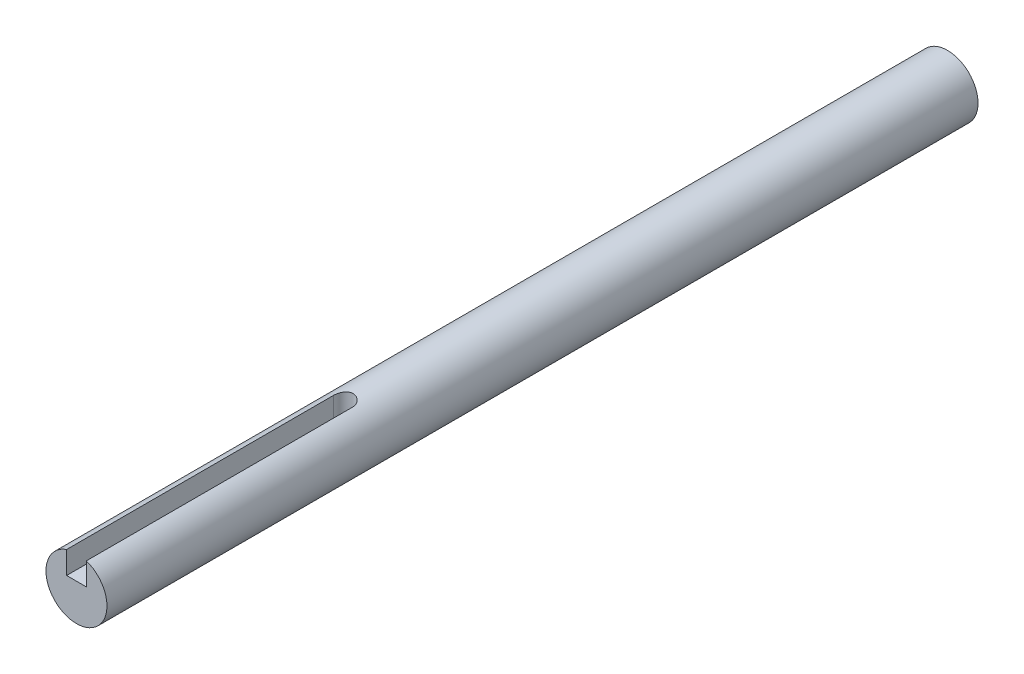
ISO-10303-21;
HEADER;
FILE_DESCRIPTION(('STEP AP214'),'2;1');
FILE_NAME('part.step','',(''),(''),'','','');
FILE_SCHEMA(('AUTOMOTIVE_DESIGN { 1 0 10303 214 1 1 1 1 }'));
ENDSEC;
DATA;
#1=APPLICATION_CONTEXT('core data for automotive mechanical design processes');
#2=APPLICATION_PROTOCOL_DEFINITION('international standard','automotive_design',2000,#1);
#3=PRODUCT_CONTEXT('',#1,'mechanical');
#4=PRODUCT('Part','Part','',(#3));
#5=PRODUCT_RELATED_PRODUCT_CATEGORY('part','',(#4));
#6=PRODUCT_DEFINITION_FORMATION('','',#4);
#7=PRODUCT_DEFINITION_CONTEXT('part definition',#1,'design');
#8=PRODUCT_DEFINITION('design','',#6,#7);
#9=PRODUCT_DEFINITION_SHAPE('','',#8);
#10=(LENGTH_UNIT() NAMED_UNIT(*) SI_UNIT(.MILLI.,.METRE.));
#11=(NAMED_UNIT(*) PLANE_ANGLE_UNIT() SI_UNIT($,.RADIAN.));
#12=(NAMED_UNIT(*) SI_UNIT($,.STERADIAN.) SOLID_ANGLE_UNIT());
#13=UNCERTAINTY_MEASURE_WITH_UNIT(LENGTH_MEASURE(1.E-05),#10,'distance_accuracy_value','');
#14=(GEOMETRIC_REPRESENTATION_CONTEXT(3) GLOBAL_UNCERTAINTY_ASSIGNED_CONTEXT((#13)) GLOBAL_UNIT_ASSIGNED_CONTEXT((#10,
#11,#12)) REPRESENTATION_CONTEXT('',''));
#15=CARTESIAN_POINT('',(0.,0.,0.));
#16=DIRECTION('',(0.,0.,1.));
#17=DIRECTION('',(1.,0.,0.));
#18=AXIS2_PLACEMENT_3D('',#15,#16,#17);
#19=CARTESIAN_POINT('',(0.,0.,114.3));
#20=DIRECTION('',(0.,0.,-1.));
#21=DIRECTION('',(-1.,0.,0.));
#22=AXIS2_PLACEMENT_3D('',#19,#20,#21);
#23=CYLINDRICAL_SURFACE('',#22,4.);
#24=DIRECTION('',(0.,0.,-1.));
#25=VECTOR('',#24,1.);
#26=CARTESIAN_POINT('',(-1.2954,3.78443375420948,114.3));
#27=LINE('',#26,#25);
#28=CARTESIAN_POINT('',(-1.2954,3.78443375420948,114.3));
#29=VERTEX_POINT('',#28);
#30=CARTESIAN_POINT('',(-1.2954,3.78443375420948,79.3));
#31=VERTEX_POINT('',#30);
#32=EDGE_CURVE('E129',#29,#31,#27,.T.);
#33=ORIENTED_EDGE('',*,*,#32,.T.);
#34=CARTESIAN_POINT('',(-1.2954,3.78443375420948,79.3));
#35=CARTESIAN_POINT('',(-1.29540089993855,3.78443038867243,79.2645856350982));
#36=CARTESIAN_POINT('',(-1.29394680043407,3.78493149033154,79.2291892763617));
#37=CARTESIAN_POINT('',(-1.28815329161314,3.78690838639297,79.158669840242));
#38=CARTESIAN_POINT('',(-1.28381462226707,3.78838393082366,79.1235466951093));
#39=CARTESIAN_POINT('',(-1.26655040295758,3.79420686955889,79.0191739781485));
#40=CARTESIAN_POINT('',(-1.2493762096202,3.79995107552805,78.9506553555383));
#41=CARTESIAN_POINT('',(-1.20430961583037,3.81447115326452,78.8176773421035));
#42=CARTESIAN_POINT('',(-1.17642248600198,3.82324553401152,78.7532159732852));
#43=CARTESIAN_POINT('',(-1.11077558649104,3.84283070963279,78.6298330755361));
#44=CARTESIAN_POINT('',(-1.07301018562487,3.85364266505619,78.5709147325813));
#45=CARTESIAN_POINT('',(-0.987200334978944,3.87652773393015,78.4581674830687));
#46=CARTESIAN_POINT('',(-0.938855564188154,3.88863084814642,78.4045732800058));
#47=CARTESIAN_POINT('',(-0.833898407008472,3.91248082642025,78.3060913876729));
#48=CARTESIAN_POINT('',(-0.777284575208968,3.92422762776082,78.261205223746));
#49=CARTESIAN_POINT('',(-0.655685042125725,3.94638861277619,78.1803588322411));
#50=CARTESIAN_POINT('',(-0.59052833686329,3.95676313868177,78.1446439859192));
#51=CARTESIAN_POINT('',(-0.454741556399191,3.97465608218752,78.0847747578372));
#52=CARTESIAN_POINT('',(-0.384113082914669,3.98217533182022,78.0606170077846));
#53=CARTESIAN_POINT('',(-0.241857410776138,3.99329749002933,78.0253401084411));
#54=CARTESIAN_POINT('',(-0.170339958465495,3.99702137324289,78.0138172479425));
#55=CARTESIAN_POINT('',(-0.0262948235930711,4.00056168444927,78.0028555556453));
#56=CARTESIAN_POINT('',(0.0462326292612889,4.00037898687836,78.003414019603));
#57=CARTESIAN_POINT('',(0.187386347106871,3.99620958823882,78.016339138081));
#58=CARTESIAN_POINT('',(0.256057590206129,3.99236408221408,78.0282675141455));
#59=CARTESIAN_POINT('',(0.390364246333562,3.98147682477638,78.0628714993921));
#60=CARTESIAN_POINT('',(0.455999492863256,3.97443489829551,78.0855476972354));
#61=CARTESIAN_POINT('',(0.583355124158089,3.95776169177717,78.1412714351817));
#62=CARTESIAN_POINT('',(0.64501488983981,3.94809852724524,78.1744475845163));
#63=CARTESIAN_POINT('',(0.762024302775174,3.92719452853168,78.2501247904345));
#64=CARTESIAN_POINT('',(0.8173723120433,3.91595328649872,78.292628259252));
#65=CARTESIAN_POINT('',(0.922793064036735,3.89249279693083,78.3879763579872));
#66=CARTESIAN_POINT('',(0.972521413439922,3.88025228871121,78.4411970284795));
#67=CARTESIAN_POINT('',(1.06246368094595,3.8565969197441,78.5553441146934));
#68=CARTESIAN_POINT('',(1.1026746285421,3.84518231754253,78.6162729271467));
#69=CARTESIAN_POINT('',(1.17288806365364,3.82435579093652,78.7451552946598));
#70=CARTESIAN_POINT('',(1.20274771286602,3.81497251163787,78.813191478514));
#71=CARTESIAN_POINT('',(1.25043886520411,3.79961057474187,78.9536696936676));
#72=CARTESIAN_POINT('',(1.26828915669409,3.79362660130247,79.0261046486862));
#73=CARTESIAN_POINT('',(1.28499130456776,3.78798385812158,79.1326989344663));
#74=CARTESIAN_POINT('',(1.28889332184615,3.78665607987967,79.1660476003343));
#75=CARTESIAN_POINT('',(1.29409576559409,3.78488057931157,79.2329249869199));
#76=CARTESIAN_POINT('',(1.29539970409083,3.78443166896493,79.2664534030565));
#77=CARTESIAN_POINT('',(1.2954,3.78443375420948,79.3));
#78=B_SPLINE_CURVE_WITH_KNOTS('',3,(#34,#35,#36,#37,#38,#39,#40,#41,#42,#43,#44,#45,#46,#47,#48,
#49,#50,#51,#52,#53,#54,#55,#56,#57,#58,#59,#60,#61,#62,#63,#64,#65,#66,#67,#68,#69,#70,#71,#72,
#73,#74,#75,#76,#77),.UNSPECIFIED.,.F.,.F.,(4,2,2,2,2,2,2,2,2,2,2,2,2,2,2,2,2,2,2,2,2,4),(0.,
0.106174536692487,0.212321847241342,0.423829768947444,0.635233764527355,0.846758536206068,
1.06532453166721,1.28392877772573,1.50788397197811,1.73177385511932,1.94828035723935,
2.16473839775983,2.37317633193305,2.58162568362652,2.79273406121236,3.00389710017801,
3.22445774440673,3.44508713801234,3.66864998053812,3.89186224571469,3.9925741935939,
4.09314990860757),.UNSPECIFIED.);
#79=CARTESIAN_POINT('',(1.2954,3.78443375420948,79.3));
#80=VERTEX_POINT('',#79);
#81=EDGE_CURVE('E80',#31,#80,#78,.T.);
#82=ORIENTED_EDGE('',*,*,#81,.T.);
#83=DIRECTION('',(0.,0.,-1.));
#84=VECTOR('',#83,1.);
#85=CARTESIAN_POINT('',(1.2954,3.78443375420948,114.3));
#86=LINE('',#85,#84);
#87=CARTESIAN_POINT('',(1.2954,3.78443375420948,114.3));
#88=VERTEX_POINT('',#87);
#89=EDGE_CURVE('E56',#80,#88,#86,.F.);
#90=ORIENTED_EDGE('',*,*,#89,.T.);
#91=CARTESIAN_POINT('',(0.,0.,114.3));
#92=DIRECTION('',(0.,0.,1.));
#93=DIRECTION('',(1.,0.,0.));
#94=AXIS2_PLACEMENT_3D('',#91,#92,#93);
#95=CIRCLE('',#94,4.);
#96=EDGE_CURVE('E11',#29,#88,#95,.T.);
#97=ORIENTED_EDGE('',*,*,#96,.F.);
#98=EDGE_LOOP('',(#33,#82,#90,#97));
#99=FACE_BOUND('',#98,.T.);
#100=CARTESIAN_POINT('',(0.,0.,0.));
#101=DIRECTION('',(0.,0.,1.));
#102=DIRECTION('',(1.,0.,0.));
#103=AXIS2_PLACEMENT_3D('',#100,#101,#102);
#104=CIRCLE('',#103,4.);
#105=CARTESIAN_POINT('',(4.,0.,0.));
#106=VERTEX_POINT('',#105);
#107=EDGE_CURVE('E37',#106,#106,#104,.T.);
#108=ORIENTED_EDGE('',*,*,#107,.T.);
#109=EDGE_LOOP('',(#108));
#110=FACE_BOUND('',#109,.T.);
#111=ADVANCED_FACE('F33',(#99,#110),#23,.T.);
#112=CARTESIAN_POINT('',(0.,0.,114.3));
#113=DIRECTION('',(0.,0.,1.));
#114=DIRECTION('',(1.,0.,0.));
#115=AXIS2_PLACEMENT_3D('',#112,#113,#114);
#116=PLANE('',#115);
#117=DIRECTION('',(0.,1.,0.));
#118=VECTOR('',#117,1.);
#119=CARTESIAN_POINT('',(1.2954,0.82500000951335,114.3));
#120=LINE('',#119,#118);
#121=CARTESIAN_POINT('',(1.2954,0.82500000951335,114.3));
#122=VERTEX_POINT('',#121);
#123=EDGE_CURVE('E99',#122,#88,#120,.T.);
#124=ORIENTED_EDGE('',*,*,#123,.F.);
#125=DIRECTION('',(1.,0.,0.));
#126=VECTOR('',#125,1.);
#127=CARTESIAN_POINT('',(-1.2954,0.82500000951335,114.3));
#128=LINE('',#127,#126);
#129=CARTESIAN_POINT('',(-1.2954,0.82500000951335,114.3));
#130=VERTEX_POINT('',#129);
#131=EDGE_CURVE('E89',#130,#122,#128,.T.);
#132=ORIENTED_EDGE('',*,*,#131,.F.);
#133=DIRECTION('',(0.,1.,0.));
#134=VECTOR('',#133,1.);
#135=CARTESIAN_POINT('',(-1.2954,0.82500000951335,114.3));
#136=LINE('',#135,#134);
#137=EDGE_CURVE('E83',#130,#29,#136,.T.);
#138=ORIENTED_EDGE('',*,*,#137,.T.);
#139=ORIENTED_EDGE('',*,*,#96,.T.);
#140=EDGE_LOOP('',(#124,#132,#138,#139));
#141=FACE_BOUND('',#140,.T.);
#142=ADVANCED_FACE('F115',(#141),#116,.T.);
#143=CARTESIAN_POINT('',(0.,0.,0.));
#144=DIRECTION('',(0.,0.,1.));
#145=DIRECTION('',(1.,0.,0.));
#146=AXIS2_PLACEMENT_3D('',#143,#144,#145);
#147=PLANE('',#146);
#148=ORIENTED_EDGE('',*,*,#107,.F.);
#149=EDGE_LOOP('',(#148));
#150=FACE_BOUND('',#149,.T.);
#151=ADVANCED_FACE('F113',(#150),#147,.F.);
#152=CARTESIAN_POINT('',(0.,0.82500000951335,79.3));
#153=DIRECTION('',(0.,1.,0.));
#154=DIRECTION('',(0.,0.,1.));
#155=AXIS2_PLACEMENT_3D('',#152,#153,#154);
#156=CYLINDRICAL_SURFACE('',#155,1.2954);
#157=DIRECTION('',(0.,1.,0.));
#158=VECTOR('',#157,1.);
#159=CARTESIAN_POINT('',(-1.2954,0.82500000951335,79.3));
#160=LINE('',#159,#158);
#161=CARTESIAN_POINT('',(-1.2954,0.82500000951335,79.3));
#162=VERTEX_POINT('',#161);
#163=EDGE_CURVE('E75',#162,#31,#160,.T.);
#164=ORIENTED_EDGE('',*,*,#163,.F.);
#165=CARTESIAN_POINT('',(0.,0.82500000951335,79.3));
#166=DIRECTION('',(0.,1.,0.));
#167=DIRECTION('',(0.,0.,-1.));
#168=AXIS2_PLACEMENT_3D('',#165,#166,#167);
#169=CIRCLE('',#168,1.2954);
#170=CARTESIAN_POINT('',(1.2954,0.82500000951335,79.3));
#171=VERTEX_POINT('',#170);
#172=EDGE_CURVE('E77',#171,#162,#169,.T.);
#173=ORIENTED_EDGE('',*,*,#172,.F.);
#174=DIRECTION('',(0.,1.,0.));
#175=VECTOR('',#174,1.);
#176=CARTESIAN_POINT('',(1.2954,0.82500000951335,79.3));
#177=LINE('',#176,#175);
#178=EDGE_CURVE('E97',#171,#80,#177,.T.);
#179=ORIENTED_EDGE('',*,*,#178,.T.);
#180=ORIENTED_EDGE('',*,*,#81,.F.);
#181=EDGE_LOOP('',(#164,#173,#179,#180));
#182=FACE_BOUND('',#181,.T.);
#183=ADVANCED_FACE('F76',(#182),#156,.F.);
#184=CARTESIAN_POINT('',(1.2954,0.82500000951335,79.3));
#185=DIRECTION('',(1.,0.,0.));
#186=DIRECTION('',(0.,0.,-1.));
#187=AXIS2_PLACEMENT_3D('',#184,#185,#186);
#188=PLANE('',#187);
#189=ORIENTED_EDGE('',*,*,#178,.F.);
#190=DIRECTION('',(0.,0.,-1.));
#191=VECTOR('',#190,1.);
#192=CARTESIAN_POINT('',(1.2954,0.82500000951335,79.3));
#193=LINE('',#192,#191);
#194=EDGE_CURVE('E84',#122,#171,#193,.T.);
#195=ORIENTED_EDGE('',*,*,#194,.F.);
#196=ORIENTED_EDGE('',*,*,#123,.T.);
#197=ORIENTED_EDGE('',*,*,#89,.F.);
#198=EDGE_LOOP('',(#189,#195,#196,#197));
#199=FACE_BOUND('',#198,.T.);
#200=ADVANCED_FACE('F112',(#199),#188,.F.);
#201=CARTESIAN_POINT('',(-1.2954,0.82500000951335,79.3));
#202=DIRECTION('',(-1.,0.,0.));
#203=DIRECTION('',(0.,0.,1.));
#204=AXIS2_PLACEMENT_3D('',#201,#202,#203);
#205=PLANE('',#204);
#206=ORIENTED_EDGE('',*,*,#137,.F.);
#207=DIRECTION('',(0.,0.,1.));
#208=VECTOR('',#207,1.);
#209=CARTESIAN_POINT('',(-1.2954,0.82500000951335,79.3));
#210=LINE('',#209,#208);
#211=EDGE_CURVE('E48',#162,#130,#210,.T.);
#212=ORIENTED_EDGE('',*,*,#211,.F.);
#213=ORIENTED_EDGE('',*,*,#163,.T.);
#214=ORIENTED_EDGE('',*,*,#32,.F.);
#215=EDGE_LOOP('',(#206,#212,#213,#214));
#216=FACE_BOUND('',#215,.T.);
#217=ADVANCED_FACE('F86',(#216),#205,.F.);
#218=CARTESIAN_POINT('',(0.,0.82500000951335,79.3));
#219=DIRECTION('',(0.,-1.,0.));
#220=DIRECTION('',(0.,0.,-1.));
#221=AXIS2_PLACEMENT_3D('',#218,#219,#220);
#222=PLANE('',#221);
#223=ORIENTED_EDGE('',*,*,#172,.T.);
#224=ORIENTED_EDGE('',*,*,#211,.T.);
#225=ORIENTED_EDGE('',*,*,#131,.T.);
#226=ORIENTED_EDGE('',*,*,#194,.T.);
#227=EDGE_LOOP('',(#223,#224,#225,#226));
#228=FACE_BOUND('',#227,.T.);
#229=ADVANCED_FACE('F91',(#228),#222,.F.);
#230=CLOSED_SHELL('',(#111,#142,#151,#183,#200,#217,#229));
#231=MANIFOLD_SOLID_BREP('B2',#230);
#232=ADVANCED_BREP_SHAPE_REPRESENTATION('',(#18,#231),#14);
#233=SHAPE_DEFINITION_REPRESENTATION(#9,#232);
ENDSEC;
END-ISO-10303-21;
